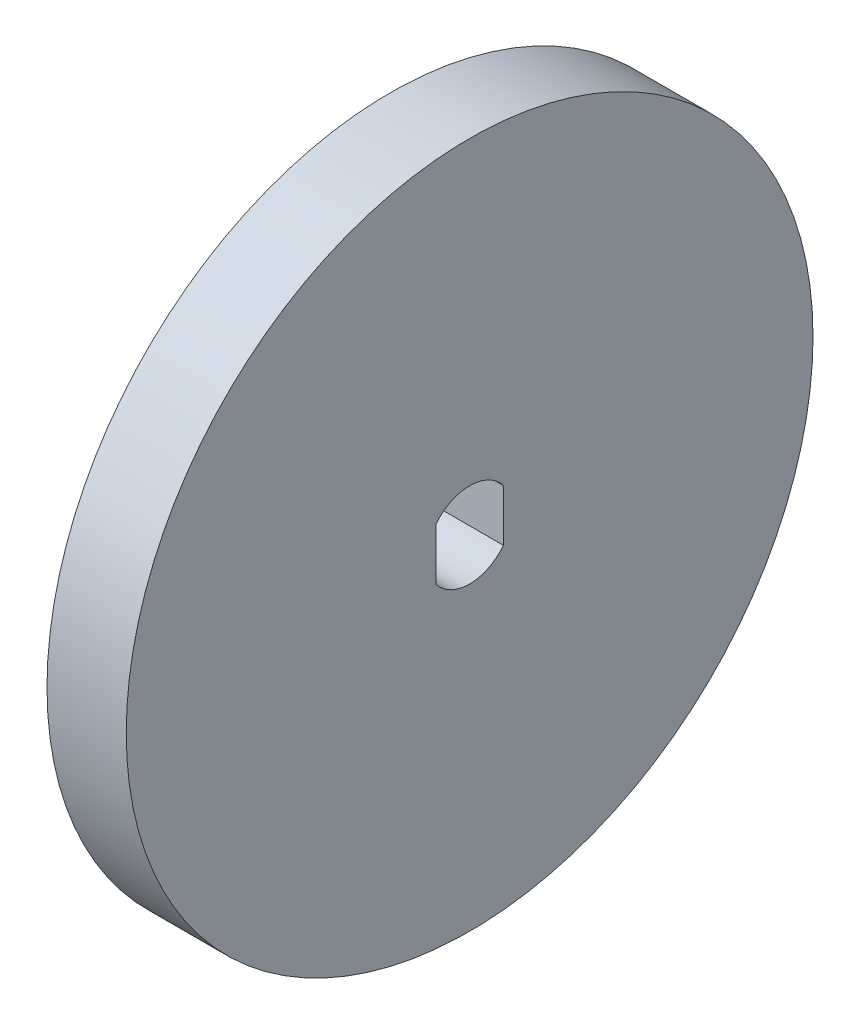
ISO-10303-21;
HEADER;
FILE_DESCRIPTION(('STEP AP214'),'2;1');
FILE_NAME('part.step','',(''),(''),'','','');
FILE_SCHEMA(('AUTOMOTIVE_DESIGN { 1 0 10303 214 1 1 1 1 }'));
ENDSEC;
DATA;
#1=APPLICATION_CONTEXT('core data for automotive mechanical design processes');
#2=APPLICATION_PROTOCOL_DEFINITION('international standard','automotive_design',2000,#1);
#3=PRODUCT_CONTEXT('',#1,'mechanical');
#4=PRODUCT('Part','Part','',(#3));
#5=PRODUCT_RELATED_PRODUCT_CATEGORY('part','',(#4));
#6=PRODUCT_DEFINITION_FORMATION('','',#4);
#7=PRODUCT_DEFINITION_CONTEXT('part definition',#1,'design');
#8=PRODUCT_DEFINITION('design','',#6,#7);
#9=PRODUCT_DEFINITION_SHAPE('','',#8);
#10=(LENGTH_UNIT() NAMED_UNIT(*) SI_UNIT(.MILLI.,.METRE.));
#11=(NAMED_UNIT(*) PLANE_ANGLE_UNIT() SI_UNIT($,.RADIAN.));
#12=(NAMED_UNIT(*) SI_UNIT($,.STERADIAN.) SOLID_ANGLE_UNIT());
#13=UNCERTAINTY_MEASURE_WITH_UNIT(LENGTH_MEASURE(1.E-05),#10,'distance_accuracy_value','');
#14=(GEOMETRIC_REPRESENTATION_CONTEXT(3) GLOBAL_UNCERTAINTY_ASSIGNED_CONTEXT((#13)) GLOBAL_UNIT_ASSIGNED_CONTEXT((#10,
#11,#12)) REPRESENTATION_CONTEXT('',''));
#15=CARTESIAN_POINT('',(0.,0.,0.));
#16=DIRECTION('',(0.,0.,1.));
#17=DIRECTION('',(1.,0.,0.));
#18=AXIS2_PLACEMENT_3D('',#15,#16,#17);
#19=CARTESIAN_POINT('',(2.7,0.,0.));
#20=DIRECTION('',(1.,0.,0.));
#21=DIRECTION('',(0.,0.,-1.));
#22=AXIS2_PLACEMENT_3D('',#19,#20,#21);
#23=PLANE('',#22);
#24=CARTESIAN_POINT('',(2.7,0.,0.));
#25=DIRECTION('',(1.,0.,0.));
#26=DIRECTION('',(0.,0.,-1.));
#27=AXIS2_PLACEMENT_3D('',#24,#25,#26);
#28=CIRCLE('',#27,11.7);
#29=CARTESIAN_POINT('',(2.7,0.,11.7));
#30=VERTEX_POINT('',#29);
#31=EDGE_CURVE('E11',#30,#30,#28,.T.);
#32=ORIENTED_EDGE('',*,*,#31,.T.);
#33=EDGE_LOOP('',(#32));
#34=FACE_BOUND('',#33,.T.);
#35=DIRECTION('',(0.,-1.,0.));
#36=VECTOR('',#35,1.);
#37=CARTESIAN_POINT('',(2.7,0.883176086632785,1.15));
#38=LINE('',#37,#36);
#39=CARTESIAN_POINT('',(2.7,0.883176086632785,1.15));
#40=VERTEX_POINT('',#39);
#41=CARTESIAN_POINT('',(2.7,-0.883176086632785,1.15));
#42=VERTEX_POINT('',#41);
#43=EDGE_CURVE('E82',#40,#42,#38,.T.);
#44=ORIENTED_EDGE('',*,*,#43,.F.);
#45=CARTESIAN_POINT('',(2.7,0.,0.));
#46=DIRECTION('',(1.,0.,0.));
#47=DIRECTION('',(0.,0.,-1.));
#48=AXIS2_PLACEMENT_3D('',#45,#46,#47);
#49=CIRCLE('',#48,1.45);
#50=CARTESIAN_POINT('',(2.7,0.883176086632785,-1.15));
#51=VERTEX_POINT('',#50);
#52=EDGE_CURVE('E74',#51,#40,#49,.T.);
#53=ORIENTED_EDGE('',*,*,#52,.F.);
#54=DIRECTION('',(0.,1.,0.));
#55=VECTOR('',#54,1.);
#56=CARTESIAN_POINT('',(2.7,0.883176086632785,-1.15));
#57=LINE('',#56,#55);
#58=CARTESIAN_POINT('',(2.7,-0.883176086632785,-1.15));
#59=VERTEX_POINT('',#58);
#60=EDGE_CURVE('E95',#59,#51,#57,.T.);
#61=ORIENTED_EDGE('',*,*,#60,.F.);
#62=CARTESIAN_POINT('',(2.7,0.,0.));
#63=DIRECTION('',(1.,0.,0.));
#64=DIRECTION('',(0.,0.,-1.));
#65=AXIS2_PLACEMENT_3D('',#62,#63,#64);
#66=CIRCLE('',#65,1.45);
#67=EDGE_CURVE('E93',#42,#59,#66,.T.);
#68=ORIENTED_EDGE('',*,*,#67,.F.);
#69=EDGE_LOOP('',(#44,#53,#61,#68));
#70=FACE_BOUND('',#69,.T.);
#71=ADVANCED_FACE('F33',(#34,#70),#23,.T.);
#72=CARTESIAN_POINT('',(0.,0.,0.));
#73=DIRECTION('',(1.,0.,0.));
#74=DIRECTION('',(0.,0.,-1.));
#75=AXIS2_PLACEMENT_3D('',#72,#73,#74);
#76=PLANE('',#75);
#77=CARTESIAN_POINT('',(0.,0.,0.));
#78=DIRECTION('',(1.,0.,0.));
#79=DIRECTION('',(0.,0.,-1.));
#80=AXIS2_PLACEMENT_3D('',#77,#78,#79);
#81=CIRCLE('',#80,11.7);
#82=CARTESIAN_POINT('',(0.,0.,11.7));
#83=VERTEX_POINT('',#82);
#84=EDGE_CURVE('E37',#83,#83,#81,.T.);
#85=ORIENTED_EDGE('',*,*,#84,.F.);
#86=EDGE_LOOP('',(#85));
#87=FACE_BOUND('',#86,.T.);
#88=CARTESIAN_POINT('',(0.,0.,0.));
#89=DIRECTION('',(1.,0.,0.));
#90=DIRECTION('',(0.,0.,-1.));
#91=AXIS2_PLACEMENT_3D('',#88,#89,#90);
#92=CIRCLE('',#91,1.45);
#93=CARTESIAN_POINT('',(0.,0.883176086632785,-1.15));
#94=VERTEX_POINT('',#93);
#95=CARTESIAN_POINT('',(0.,0.883176086632785,1.15));
#96=VERTEX_POINT('',#95);
#97=EDGE_CURVE('E56',#94,#96,#92,.T.);
#98=ORIENTED_EDGE('',*,*,#97,.T.);
#99=DIRECTION('',(0.,-1.,0.));
#100=VECTOR('',#99,1.);
#101=CARTESIAN_POINT('',(0.,0.883176086632785,1.15));
#102=LINE('',#101,#100);
#103=CARTESIAN_POINT('',(0.,-0.883176086632785,1.15));
#104=VERTEX_POINT('',#103);
#105=EDGE_CURVE('E89',#96,#104,#102,.T.);
#106=ORIENTED_EDGE('',*,*,#105,.T.);
#107=CARTESIAN_POINT('',(0.,0.,0.));
#108=DIRECTION('',(1.,0.,0.));
#109=DIRECTION('',(0.,0.,-1.));
#110=AXIS2_PLACEMENT_3D('',#107,#108,#109);
#111=CIRCLE('',#110,1.45);
#112=CARTESIAN_POINT('',(0.,-0.883176086632785,-1.15));
#113=VERTEX_POINT('',#112);
#114=EDGE_CURVE('E101',#104,#113,#111,.T.);
#115=ORIENTED_EDGE('',*,*,#114,.T.);
#116=DIRECTION('',(0.,1.,0.));
#117=VECTOR('',#116,1.);
#118=CARTESIAN_POINT('',(0.,0.883176086632785,-1.15));
#119=LINE('',#118,#117);
#120=EDGE_CURVE('E83',#113,#94,#119,.T.);
#121=ORIENTED_EDGE('',*,*,#120,.T.);
#122=EDGE_LOOP('',(#98,#106,#115,#121));
#123=FACE_BOUND('',#122,.T.);
#124=ADVANCED_FACE('F112',(#87,#123),#76,.F.);
#125=CARTESIAN_POINT('',(2.7,0.,0.));
#126=DIRECTION('',(-1.,0.,0.));
#127=DIRECTION('',(0.,0.,1.));
#128=AXIS2_PLACEMENT_3D('',#125,#126,#127);
#129=CYLINDRICAL_SURFACE('',#128,11.7);
#130=CARTESIAN_POINT('',(2.7,0.,11.7));
#131=CARTESIAN_POINT('',(2.671875,0.,11.7));
#132=CARTESIAN_POINT('',(2.64375,0.,11.7));
#133=CARTESIAN_POINT('',(2.5875,0.,11.7));
#134=CARTESIAN_POINT('',(2.559375,0.,11.7));
#135=CARTESIAN_POINT('',(2.503125,0.,11.7));
#136=CARTESIAN_POINT('',(2.475,0.,11.7));
#137=CARTESIAN_POINT('',(2.41875,0.,11.7));
#138=CARTESIAN_POINT('',(2.390625,0.,11.7));
#139=CARTESIAN_POINT('',(2.334375,0.,11.7));
#140=CARTESIAN_POINT('',(2.30625,0.,11.7));
#141=CARTESIAN_POINT('',(2.25,0.,11.7));
#142=CARTESIAN_POINT('',(2.221875,0.,11.7));
#143=CARTESIAN_POINT('',(2.165625,0.,11.7));
#144=CARTESIAN_POINT('',(2.1375,0.,11.7));
#145=CARTESIAN_POINT('',(2.08125,0.,11.7));
#146=CARTESIAN_POINT('',(2.053125,0.,11.7));
#147=CARTESIAN_POINT('',(1.996875,0.,11.7));
#148=CARTESIAN_POINT('',(1.96875,0.,11.7));
#149=CARTESIAN_POINT('',(1.9125,0.,11.7));
#150=CARTESIAN_POINT('',(1.884375,0.,11.7));
#151=CARTESIAN_POINT('',(1.828125,0.,11.7));
#152=CARTESIAN_POINT('',(1.8,0.,11.7));
#153=CARTESIAN_POINT('',(1.74375,0.,11.7));
#154=CARTESIAN_POINT('',(1.715625,0.,11.7));
#155=CARTESIAN_POINT('',(1.659375,0.,11.7));
#156=CARTESIAN_POINT('',(1.63125,0.,11.7));
#157=CARTESIAN_POINT('',(1.575,0.,11.7));
#158=CARTESIAN_POINT('',(1.546875,0.,11.7));
#159=CARTESIAN_POINT('',(1.490625,0.,11.7));
#160=CARTESIAN_POINT('',(1.4625,0.,11.7));
#161=CARTESIAN_POINT('',(1.40625,0.,11.7));
#162=CARTESIAN_POINT('',(1.378125,0.,11.7));
#163=CARTESIAN_POINT('',(1.321875,0.,11.7));
#164=CARTESIAN_POINT('',(1.29375,0.,11.7));
#165=CARTESIAN_POINT('',(1.2375,0.,11.7));
#166=CARTESIAN_POINT('',(1.209375,0.,11.7));
#167=CARTESIAN_POINT('',(1.153125,0.,11.7));
#168=CARTESIAN_POINT('',(1.125,0.,11.7));
#169=CARTESIAN_POINT('',(1.06875,0.,11.7));
#170=CARTESIAN_POINT('',(1.040625,0.,11.7));
#171=CARTESIAN_POINT('',(0.984375,0.,11.7));
#172=CARTESIAN_POINT('',(0.956249999999999,0.,11.7));
#173=CARTESIAN_POINT('',(0.899999999999999,0.,11.7));
#174=CARTESIAN_POINT('',(0.871875,0.,11.7));
#175=CARTESIAN_POINT('',(0.815624999999999,0.,11.7));
#176=CARTESIAN_POINT('',(0.787499999999999,0.,11.7));
#177=CARTESIAN_POINT('',(0.73125,0.,11.7));
#178=CARTESIAN_POINT('',(0.703125,0.,11.7));
#179=CARTESIAN_POINT('',(0.646875,0.,11.7));
#180=CARTESIAN_POINT('',(0.61875,0.,11.7));
#181=CARTESIAN_POINT('',(0.5625,0.,11.7));
#182=CARTESIAN_POINT('',(0.534375,0.,11.7));
#183=CARTESIAN_POINT('',(0.478125,0.,11.7));
#184=CARTESIAN_POINT('',(0.45,0.,11.7));
#185=CARTESIAN_POINT('',(0.39375,0.,11.7));
#186=CARTESIAN_POINT('',(0.365625,0.,11.7));
#187=CARTESIAN_POINT('',(0.309375,0.,11.7));
#188=CARTESIAN_POINT('',(0.28125,0.,11.7));
#189=CARTESIAN_POINT('',(0.225,0.,11.7));
#190=CARTESIAN_POINT('',(0.196875,0.,11.7));
#191=CARTESIAN_POINT('',(0.140625,0.,11.7));
#192=CARTESIAN_POINT('',(0.1125,0.,11.7));
#193=CARTESIAN_POINT('',(0.0562499999999997,0.,11.7));
#194=CARTESIAN_POINT('',(0.0281249999999996,0.,11.7));
#195=CARTESIAN_POINT('',(0.,0.,11.7));
#196=B_SPLINE_CURVE_WITH_KNOTS('',3,(#130,#131,#132,#133,#134,#135,#136,#137,#138,#139,#140,
#141,#142,#143,#144,#145,#146,#147,#148,#149,#150,#151,#152,#153,#154,#155,#156,#157,#158,#159,
#160,#161,#162,#163,#164,#165,#166,#167,#168,#169,#170,#171,#172,#173,#174,#175,#176,#177,#178,
#179,#180,#181,#182,#183,#184,#185,#186,#187,#188,#189,#190,#191,#192,#193,#194,#195),
.UNSPECIFIED.,.F.,.F.,(4,2,2,2,2,2,2,2,2,2,2,2,2,2,2,2,2,2,2,2,2,2,2,2,2,2,2,2,2,2,2,2,4),(0.,
0.0843750000000003,0.16875,0.253125,0.3375,0.421875,0.50625,0.590625,0.675,0.759375,0.84375,
0.928125000000001,1.0125,1.096875,1.18125,1.265625,1.35,1.434375,1.51875,1.603125,1.6875,
1.771875,1.85625,1.940625,2.025,2.109375,2.19375,2.278125,2.3625,2.446875,2.53125,2.615625,2.7),.UNSPECIFIED.);
#197=EDGE_CURVE('BSEAM35',#30,#83,#196,.T.);
#198=ORIENTED_EDGE('',*,*,#31,.F.);
#199=ORIENTED_EDGE('',*,*,#84,.T.);
#200=ORIENTED_EDGE('',*,*,#197,.T.);
#201=ORIENTED_EDGE('',*,*,#197,.F.);
#202=EDGE_LOOP('',(#198,#200,#199,#201));
#203=FACE_BOUND('',#202,.T.);
#204=ADVANCED_FACE('F35',(#203),#129,.T.);
#205=CARTESIAN_POINT('',(2.7,0.,0.));
#206=DIRECTION('',(-1.,0.,0.));
#207=DIRECTION('',(0.,0.,1.));
#208=AXIS2_PLACEMENT_3D('',#205,#206,#207);
#209=CYLINDRICAL_SURFACE('',#208,1.45);
#210=ORIENTED_EDGE('',*,*,#97,.F.);
#211=DIRECTION('',(-1.,0.,0.));
#212=VECTOR('',#211,1.);
#213=CARTESIAN_POINT('',(2.7,0.883176086632785,-1.15));
#214=LINE('',#213,#212);
#215=EDGE_CURVE('E78',#51,#94,#214,.T.);
#216=ORIENTED_EDGE('',*,*,#215,.F.);
#217=ORIENTED_EDGE('',*,*,#52,.T.);
#218=DIRECTION('',(-1.,0.,0.));
#219=VECTOR('',#218,1.);
#220=CARTESIAN_POINT('',(2.7,0.883176086632785,1.15));
#221=LINE('',#220,#219);
#222=EDGE_CURVE('E77',#40,#96,#221,.T.);
#223=ORIENTED_EDGE('',*,*,#222,.T.);
#224=EDGE_LOOP('',(#210,#216,#217,#223));
#225=FACE_BOUND('',#224,.T.);
#226=ADVANCED_FACE('F76',(#225),#209,.F.);
#227=CARTESIAN_POINT('',(2.7,0.883176086632785,1.15));
#228=DIRECTION('',(0.,0.,-1.));
#229=DIRECTION('',(-1.,0.,0.));
#230=AXIS2_PLACEMENT_3D('',#227,#228,#229);
#231=PLANE('',#230);
#232=ORIENTED_EDGE('',*,*,#105,.F.);
#233=ORIENTED_EDGE('',*,*,#222,.F.);
#234=ORIENTED_EDGE('',*,*,#43,.T.);
#235=DIRECTION('',(-1.,0.,0.));
#236=VECTOR('',#235,1.);
#237=CARTESIAN_POINT('',(2.7,-0.883176086632785,1.15));
#238=LINE('',#237,#236);
#239=EDGE_CURVE('E90',#42,#104,#238,.T.);
#240=ORIENTED_EDGE('',*,*,#239,.T.);
#241=EDGE_LOOP('',(#232,#233,#234,#240));
#242=FACE_BOUND('',#241,.T.);
#243=ADVANCED_FACE('F86',(#242),#231,.T.);
#244=CARTESIAN_POINT('',(2.7,0.,0.));
#245=DIRECTION('',(-1.,0.,0.));
#246=DIRECTION('',(0.,0.,1.));
#247=AXIS2_PLACEMENT_3D('',#244,#245,#246);
#248=CYLINDRICAL_SURFACE('',#247,1.45);
#249=ORIENTED_EDGE('',*,*,#114,.F.);
#250=ORIENTED_EDGE('',*,*,#239,.F.);
#251=ORIENTED_EDGE('',*,*,#67,.T.);
#252=DIRECTION('',(-1.,0.,0.));
#253=VECTOR('',#252,1.);
#254=CARTESIAN_POINT('',(2.7,-0.883176086632785,-1.15));
#255=LINE('',#254,#253);
#256=EDGE_CURVE('E48',#59,#113,#255,.T.);
#257=ORIENTED_EDGE('',*,*,#256,.T.);
#258=EDGE_LOOP('',(#249,#250,#251,#257));
#259=FACE_BOUND('',#258,.T.);
#260=ADVANCED_FACE('F110',(#259),#248,.F.);
#261=CARTESIAN_POINT('',(2.7,0.883176086632785,-1.15));
#262=DIRECTION('',(0.,0.,1.));
#263=DIRECTION('',(1.,0.,0.));
#264=AXIS2_PLACEMENT_3D('',#261,#262,#263);
#265=PLANE('',#264);
#266=ORIENTED_EDGE('',*,*,#120,.F.);
#267=ORIENTED_EDGE('',*,*,#256,.F.);
#268=ORIENTED_EDGE('',*,*,#60,.T.);
#269=ORIENTED_EDGE('',*,*,#215,.T.);
#270=EDGE_LOOP('',(#266,#267,#268,#269));
#271=FACE_BOUND('',#270,.T.);
#272=ADVANCED_FACE('F113',(#271),#265,.T.);
#273=CLOSED_SHELL('',(#71,#124,#204,#226,#243,#260,#272));
#274=MANIFOLD_SOLID_BREP('B2',#273);
#275=ADVANCED_BREP_SHAPE_REPRESENTATION('',(#18,#274),#14);
#276=SHAPE_DEFINITION_REPRESENTATION(#9,#275);
ENDSEC;
END-ISO-10303-21;
